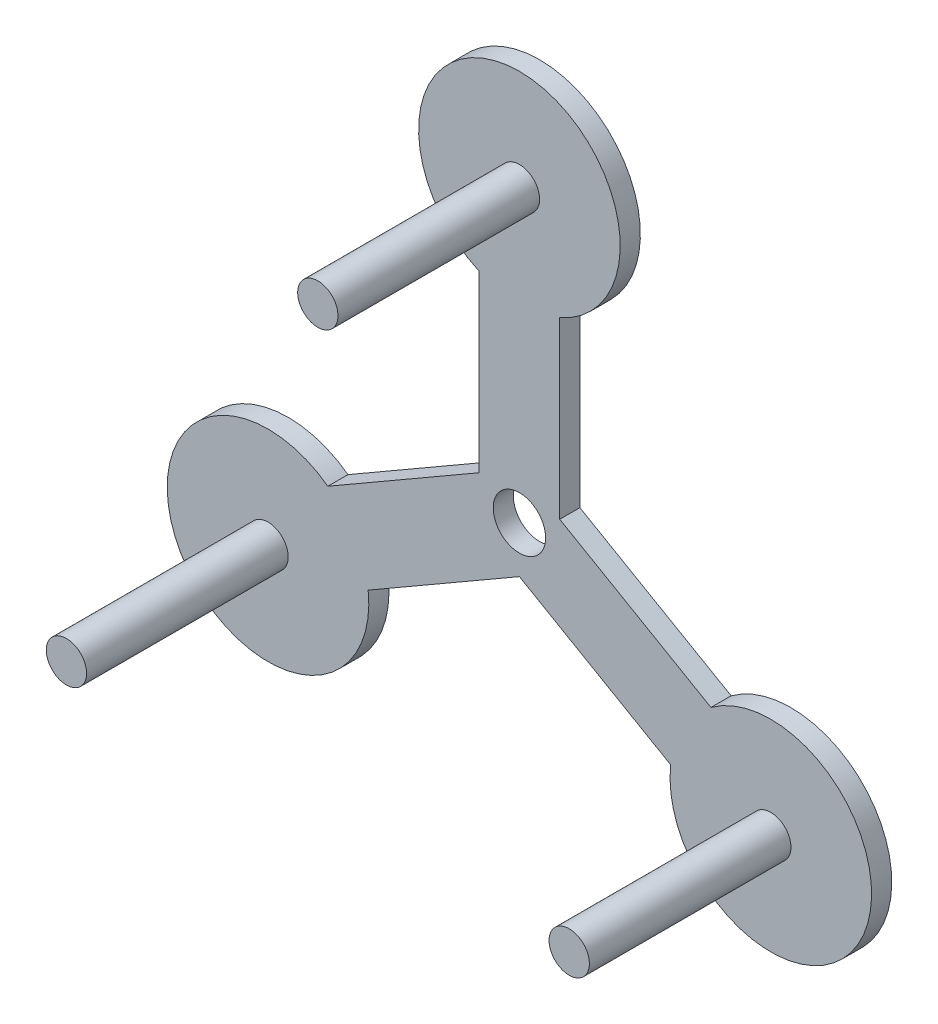
ISO-10303-21;
HEADER;
FILE_DESCRIPTION(('STEP AP214'),'2;1');
FILE_NAME('part.step','',(''),(''),'','','');
FILE_SCHEMA(('AUTOMOTIVE_DESIGN { 1 0 10303 214 1 1 1 1 }'));
ENDSEC;
DATA;
#1=APPLICATION_CONTEXT('core data for automotive mechanical design processes');
#2=APPLICATION_PROTOCOL_DEFINITION('international standard','automotive_design',2000,#1);
#3=PRODUCT_CONTEXT('',#1,'mechanical');
#4=PRODUCT('Part','Part','',(#3));
#5=PRODUCT_RELATED_PRODUCT_CATEGORY('part','',(#4));
#6=PRODUCT_DEFINITION_FORMATION('','',#4);
#7=PRODUCT_DEFINITION_CONTEXT('part definition',#1,'design');
#8=PRODUCT_DEFINITION('design','',#6,#7);
#9=PRODUCT_DEFINITION_SHAPE('','',#8);
#10=(LENGTH_UNIT() NAMED_UNIT(*) SI_UNIT(.MILLI.,.METRE.));
#11=(NAMED_UNIT(*) PLANE_ANGLE_UNIT() SI_UNIT($,.RADIAN.));
#12=(NAMED_UNIT(*) SI_UNIT($,.STERADIAN.) SOLID_ANGLE_UNIT());
#13=UNCERTAINTY_MEASURE_WITH_UNIT(LENGTH_MEASURE(1.E-05),#10,'distance_accuracy_value','');
#14=(GEOMETRIC_REPRESENTATION_CONTEXT(3) GLOBAL_UNCERTAINTY_ASSIGNED_CONTEXT((#13)) GLOBAL_UNIT_ASSIGNED_CONTEXT((#10,
#11,#12)) REPRESENTATION_CONTEXT('',''));
#15=CARTESIAN_POINT('',(0.,0.,0.));
#16=DIRECTION('',(0.,0.,1.));
#17=DIRECTION('',(1.,0.,0.));
#18=AXIS2_PLACEMENT_3D('',#15,#16,#17);
#19=CARTESIAN_POINT('',(9.99468367372348E-12,143.999999999995,100.));
#20=DIRECTION('',(0.,0.,-1.));
#21=DIRECTION('',(-1.,0.,0.));
#22=AXIS2_PLACEMENT_3D('',#19,#20,#21);
#23=CYLINDRICAL_SURFACE('',#22,9.999999999992);
#24=CARTESIAN_POINT('',(9.99468367372348E-12,143.999999999995,10.));
#25=DIRECTION('',(0.,0.,1.));
#26=DIRECTION('',(1.,0.,0.));
#27=AXIS2_PLACEMENT_3D('',#24,#25,#26);
#28=CIRCLE('',#27,9.999999999992);
#29=CARTESIAN_POINT('',(-9.999999999982,143.999999999995,10.));
#30=VERTEX_POINT('',#29);
#31=EDGE_CURVE('E182',#30,#30,#28,.T.);
#32=CARTESIAN_POINT('',(9.99468367372348E-12,143.999999999995,110.));
#33=DIRECTION('',(0.,0.,1.));
#34=DIRECTION('',(1.,0.,0.));
#35=AXIS2_PLACEMENT_3D('',#32,#33,#34);
#36=CIRCLE('',#35,9.99999999999199);
#37=CARTESIAN_POINT('',(-9.999999999982,143.999999999995,110.));
#38=VERTEX_POINT('',#37);
#39=EDGE_CURVE('E196',#38,#38,#36,.T.);
#40=CARTESIAN_POINT('',(-9.999999999982,143.999999999995,10.));
#41=CARTESIAN_POINT('',(-9.999999999982,143.999999999995,11.0416666666667));
#42=CARTESIAN_POINT('',(-9.999999999982,143.999999999995,12.0833333333333));
#43=CARTESIAN_POINT('',(-9.999999999982,143.999999999995,14.1666666666667));
#44=CARTESIAN_POINT('',(-9.999999999982,143.999999999995,15.2083333333333));
#45=CARTESIAN_POINT('',(-9.999999999982,143.999999999995,17.2916666666667));
#46=CARTESIAN_POINT('',(-9.999999999982,143.999999999995,18.3333333333333));
#47=CARTESIAN_POINT('',(-9.999999999982,143.999999999995,20.4166666666667));
#48=CARTESIAN_POINT('',(-9.999999999982,143.999999999995,21.4583333333333));
#49=CARTESIAN_POINT('',(-9.999999999982,143.999999999995,23.5416666666667));
#50=CARTESIAN_POINT('',(-9.999999999982,143.999999999995,24.5833333333333));
#51=CARTESIAN_POINT('',(-9.999999999982,143.999999999995,26.6666666666667));
#52=CARTESIAN_POINT('',(-9.999999999982,143.999999999995,27.7083333333333));
#53=CARTESIAN_POINT('',(-9.999999999982,143.999999999995,29.7916666666667));
#54=CARTESIAN_POINT('',(-9.999999999982,143.999999999995,30.8333333333333));
#55=CARTESIAN_POINT('',(-9.999999999982,143.999999999995,32.9166666666667));
#56=CARTESIAN_POINT('',(-9.999999999982,143.999999999995,33.9583333333333));
#57=CARTESIAN_POINT('',(-9.999999999982,143.999999999995,36.0416666666667));
#58=CARTESIAN_POINT('',(-9.999999999982,143.999999999995,37.0833333333333));
#59=CARTESIAN_POINT('',(-9.999999999982,143.999999999995,39.1666666666667));
#60=CARTESIAN_POINT('',(-9.999999999982,143.999999999995,40.2083333333333));
#61=CARTESIAN_POINT('',(-9.999999999982,143.999999999995,42.2916666666667));
#62=CARTESIAN_POINT('',(-9.999999999982,143.999999999995,43.3333333333333));
#63=CARTESIAN_POINT('',(-9.999999999982,143.999999999995,45.4166666666667));
#64=CARTESIAN_POINT('',(-9.999999999982,143.999999999995,46.4583333333333));
#65=CARTESIAN_POINT('',(-9.999999999982,143.999999999995,48.5416666666667));
#66=CARTESIAN_POINT('',(-9.999999999982,143.999999999995,49.5833333333333));
#67=CARTESIAN_POINT('',(-9.999999999982,143.999999999995,51.6666666666667));
#68=CARTESIAN_POINT('',(-9.999999999982,143.999999999995,52.7083333333333));
#69=CARTESIAN_POINT('',(-9.999999999982,143.999999999995,54.7916666666667));
#70=CARTESIAN_POINT('',(-9.999999999982,143.999999999995,55.8333333333333));
#71=CARTESIAN_POINT('',(-9.999999999982,143.999999999995,57.9166666666667));
#72=CARTESIAN_POINT('',(-9.999999999982,143.999999999995,58.9583333333333));
#73=CARTESIAN_POINT('',(-9.999999999982,143.999999999995,61.0416666666667));
#74=CARTESIAN_POINT('',(-9.999999999982,143.999999999995,62.0833333333333));
#75=CARTESIAN_POINT('',(-9.999999999982,143.999999999995,64.1666666666666));
#76=CARTESIAN_POINT('',(-9.999999999982,143.999999999995,65.2083333333333));
#77=CARTESIAN_POINT('',(-9.999999999982,143.999999999995,67.2916666666667));
#78=CARTESIAN_POINT('',(-9.999999999982,143.999999999995,68.3333333333333));
#79=CARTESIAN_POINT('',(-9.999999999982,143.999999999995,70.4166666666666));
#80=CARTESIAN_POINT('',(-9.999999999982,143.999999999995,71.4583333333333));
#81=CARTESIAN_POINT('',(-9.999999999982,143.999999999995,73.5416666666666));
#82=CARTESIAN_POINT('',(-9.999999999982,143.999999999995,74.5833333333333));
#83=CARTESIAN_POINT('',(-9.999999999982,143.999999999995,76.6666666666666));
#84=CARTESIAN_POINT('',(-9.999999999982,143.999999999995,77.7083333333333));
#85=CARTESIAN_POINT('',(-9.999999999982,143.999999999995,79.7916666666666));
#86=CARTESIAN_POINT('',(-9.999999999982,143.999999999995,80.8333333333333));
#87=CARTESIAN_POINT('',(-9.999999999982,143.999999999995,82.9166666666666));
#88=CARTESIAN_POINT('',(-9.999999999982,143.999999999995,83.9583333333333));
#89=CARTESIAN_POINT('',(-9.999999999982,143.999999999995,86.0416666666666));
#90=CARTESIAN_POINT('',(-9.999999999982,143.999999999995,87.0833333333333));
#91=CARTESIAN_POINT('',(-9.999999999982,143.999999999995,89.1666666666666));
#92=CARTESIAN_POINT('',(-9.999999999982,143.999999999995,90.2083333333333));
#93=CARTESIAN_POINT('',(-9.999999999982,143.999999999995,92.2916666666666));
#94=CARTESIAN_POINT('',(-9.999999999982,143.999999999995,93.3333333333333));
#95=CARTESIAN_POINT('',(-9.999999999982,143.999999999995,95.4166666666666));
#96=CARTESIAN_POINT('',(-9.999999999982,143.999999999995,96.4583333333333));
#97=CARTESIAN_POINT('',(-9.999999999982,143.999999999995,98.5416666666666));
#98=CARTESIAN_POINT('',(-9.999999999982,143.999999999995,99.5833333333333));
#99=CARTESIAN_POINT('',(-9.999999999982,143.999999999995,101.666666666667));
#100=CARTESIAN_POINT('',(-9.999999999982,143.999999999995,102.708333333333));
#101=CARTESIAN_POINT('',(-9.999999999982,143.999999999995,104.791666666667));
#102=CARTESIAN_POINT('',(-9.999999999982,143.999999999995,105.833333333333));
#103=CARTESIAN_POINT('',(-9.999999999982,143.999999999995,107.916666666667));
#104=CARTESIAN_POINT('',(-9.999999999982,143.999999999995,108.958333333333));
#105=CARTESIAN_POINT('',(-9.999999999982,143.999999999995,110.));
#106=B_SPLINE_CURVE_WITH_KNOTS('',3,(#40,#41,#42,#43,#44,#45,#46,#47,#48,#49,#50,#51,#52,#53,
#54,#55,#56,#57,#58,#59,#60,#61,#62,#63,#64,#65,#66,#67,#68,#69,#70,#71,#72,#73,#74,#75,#76,#77,
#78,#79,#80,#81,#82,#83,#84,#85,#86,#87,#88,#89,#90,#91,#92,#93,#94,#95,#96,#97,#98,#99,#100,
#101,#102,#103,#104,#105),.UNSPECIFIED.,.F.,.F.,(4,2,2,2,2,2,2,2,2,2,2,2,2,2,2,2,2,2,2,2,2,2,2,
2,2,2,2,2,2,2,2,2,4),(0.,3.125,6.25000000000001,9.37499999999999,12.5,15.625,18.75,21.875,25.,
28.125,31.25,34.375,37.5,40.625,43.75,46.875,50.,53.125,56.25,59.375,62.5,65.625,68.75,71.875,
75.,78.125,81.25,84.375,87.5,90.625,93.75,96.875,100.),.UNSPECIFIED.);
#107=EDGE_CURVE('BSEAM32',#30,#38,#106,.T.);
#108=ORIENTED_EDGE('',*,*,#31,.T.);
#109=ORIENTED_EDGE('',*,*,#39,.F.);
#110=ORIENTED_EDGE('',*,*,#107,.T.);
#111=ORIENTED_EDGE('',*,*,#107,.F.);
#112=EDGE_LOOP('',(#108,#110,#109,#111));
#113=FACE_BOUND('',#112,.T.);
#114=ADVANCED_FACE('F32',(#113),#23,.T.);
#115=CARTESIAN_POINT('',(-20.,11.5470053837933,10.));
#116=DIRECTION('',(1.,0.,0.));
#117=DIRECTION('',(0.,0.,-1.));
#118=AXIS2_PLACEMENT_3D('',#115,#116,#117);
#119=PLANE('',#118);
#120=DIRECTION('',(0.,-1.,0.));
#121=VECTOR('',#120,1.);
#122=CARTESIAN_POINT('',(-20.,11.5470053837933,10.));
#123=LINE('',#122,#121);
#124=CARTESIAN_POINT('',(-20.,98.1742430504419,10.));
#125=VERTEX_POINT('',#124);
#126=CARTESIAN_POINT('',(-20.,11.5470053837933,10.));
#127=VERTEX_POINT('',#126);
#128=EDGE_CURVE('E127',#125,#127,#123,.T.);
#129=ORIENTED_EDGE('',*,*,#128,.F.);
#130=DIRECTION('',(0.,0.,1.));
#131=VECTOR('',#130,1.);
#132=CARTESIAN_POINT('',(-20.,98.1742430504419,0.));
#133=LINE('',#132,#131);
#134=CARTESIAN_POINT('',(-20.,98.1742430504419,0.));
#135=VERTEX_POINT('',#134);
#136=EDGE_CURVE('E169',#125,#135,#133,.F.);
#137=ORIENTED_EDGE('',*,*,#136,.T.);
#138=DIRECTION('',(0.,-1.,0.));
#139=VECTOR('',#138,1.);
#140=CARTESIAN_POINT('',(-20.,11.5470053837933,0.));
#141=LINE('',#140,#139);
#142=CARTESIAN_POINT('',(-20.,11.5470053837933,0.));
#143=VERTEX_POINT('',#142);
#144=EDGE_CURVE('E150',#135,#143,#141,.T.);
#145=ORIENTED_EDGE('',*,*,#144,.T.);
#146=DIRECTION('',(0.,0.,-1.));
#147=VECTOR('',#146,1.);
#148=CARTESIAN_POINT('',(-20.,11.5470053837933,10.));
#149=LINE('',#148,#147);
#150=EDGE_CURVE('E11',#127,#143,#149,.T.);
#151=ORIENTED_EDGE('',*,*,#150,.F.);
#152=EDGE_LOOP('',(#129,#137,#145,#151));
#153=FACE_BOUND('',#152,.T.);
#154=ADVANCED_FACE('F34',(#153),#119,.F.);
#155=CARTESIAN_POINT('',(-134.707658144959,-54.6794919243113,10.));
#156=DIRECTION('',(0.500000000000004,-0.866025403784436,0.));
#157=DIRECTION('',(0.866025403784436,0.500000000000004,0.));
#158=AXIS2_PLACEMENT_3D('',#155,#156,#157);
#159=PLANE('',#158);
#160=DIRECTION('',(-0.866025403784436,-0.500000000000004,0.));
#161=VECTOR('',#160,1.);
#162=CARTESIAN_POINT('',(-134.707658144959,-54.6794919243113,0.));
#163=LINE('',#162,#161);
#164=CARTESIAN_POINT('',(-95.0213884789905,-31.7666134495318,0.));
#165=VERTEX_POINT('',#164);
#166=EDGE_CURVE('E149',#143,#165,#163,.T.);
#167=ORIENTED_EDGE('',*,*,#166,.T.);
#168=DIRECTION('',(0.,0.,1.));
#169=VECTOR('',#168,1.);
#170=CARTESIAN_POINT('',(-95.0213884789905,-31.7666134495319,0.));
#171=LINE('',#170,#169);
#172=CARTESIAN_POINT('',(-95.0213884789905,-31.7666134495318,10.));
#173=VERTEX_POINT('',#172);
#174=EDGE_CURVE('E154',#165,#173,#171,.T.);
#175=ORIENTED_EDGE('',*,*,#174,.T.);
#176=DIRECTION('',(-0.866025403784436,-0.500000000000004,0.));
#177=VECTOR('',#176,1.);
#178=CARTESIAN_POINT('',(-134.707658144959,-54.6794919243113,10.));
#179=LINE('',#178,#177);
#180=EDGE_CURVE('E161',#127,#173,#179,.T.);
#181=ORIENTED_EDGE('',*,*,#180,.F.);
#182=ORIENTED_EDGE('',*,*,#150,.T.);
#183=EDGE_LOOP('',(#167,#175,#181,#182));
#184=FACE_BOUND('',#183,.T.);
#185=ADVANCED_FACE('F230',(#184),#159,.F.);
#186=CARTESIAN_POINT('',(0.,-23.0940107675842,10.));
#187=DIRECTION('',(-0.500000000000005,0.866025403784436,0.));
#188=DIRECTION('',(-0.866025403784436,-0.500000000000005,0.));
#189=AXIS2_PLACEMENT_3D('',#186,#187,#188);
#190=PLANE('',#189);
#191=DIRECTION('',(0.866025403784436,0.500000000000004,0.));
#192=VECTOR('',#191,1.);
#193=CARTESIAN_POINT('',(0.,-23.0940107675842,10.));
#194=LINE('',#193,#192);
#195=CARTESIAN_POINT('',(-75.0213884789903,-66.4076296009093,10.));
#196=VERTEX_POINT('',#195);
#197=CARTESIAN_POINT('',(0.,-23.0940107675842,10.));
#198=VERTEX_POINT('',#197);
#199=EDGE_CURVE('E159',#196,#198,#194,.T.);
#200=ORIENTED_EDGE('',*,*,#199,.F.);
#201=DIRECTION('',(0.,0.,1.));
#202=VECTOR('',#201,1.);
#203=CARTESIAN_POINT('',(-75.0213884789903,-66.4076296009093,0.));
#204=LINE('',#203,#202);
#205=CARTESIAN_POINT('',(-75.0213884789903,-66.4076296009093,0.));
#206=VERTEX_POINT('',#205);
#207=EDGE_CURVE('E166',#196,#206,#204,.F.);
#208=ORIENTED_EDGE('',*,*,#207,.T.);
#209=DIRECTION('',(0.866025403784436,0.500000000000004,0.));
#210=VECTOR('',#209,1.);
#211=CARTESIAN_POINT('',(0.,-23.0940107675842,0.));
#212=LINE('',#211,#210);
#213=CARTESIAN_POINT('',(0.,-23.0940107675842,0.));
#214=VERTEX_POINT('',#213);
#215=EDGE_CURVE('E129',#206,#214,#212,.T.);
#216=ORIENTED_EDGE('',*,*,#215,.T.);
#217=DIRECTION('',(0.,0.,-1.));
#218=VECTOR('',#217,1.);
#219=CARTESIAN_POINT('',(0.,-23.0940107675842,10.));
#220=LINE('',#219,#218);
#221=EDGE_CURVE('E40',#198,#214,#220,.T.);
#222=ORIENTED_EDGE('',*,*,#221,.F.);
#223=EDGE_LOOP('',(#200,#208,#216,#222));
#224=FACE_BOUND('',#223,.T.);
#225=ADVANCED_FACE('F256',(#224),#190,.F.);
#226=CARTESIAN_POINT('',(114.707658144959,-89.3205080756888,10.));
#227=DIRECTION('',(0.500000000000004,0.866025403784436,0.));
#228=DIRECTION('',(-0.866025403784436,0.500000000000004,0.));
#229=AXIS2_PLACEMENT_3D('',#226,#227,#228);
#230=PLANE('',#229);
#231=DIRECTION('',(0.866025403784436,-0.500000000000004,0.));
#232=VECTOR('',#231,1.);
#233=CARTESIAN_POINT('',(114.707658144959,-89.3205080756888,0.));
#234=LINE('',#233,#232);
#235=CARTESIAN_POINT('',(75.0213884789898,-66.407629600909,0.));
#236=VERTEX_POINT('',#235);
#237=EDGE_CURVE('E125',#214,#236,#234,.T.);
#238=ORIENTED_EDGE('',*,*,#237,.T.);
#239=DIRECTION('',(0.,0.,1.));
#240=VECTOR('',#239,1.);
#241=CARTESIAN_POINT('',(75.0213884789898,-66.407629600909,0.));
#242=LINE('',#241,#240);
#243=CARTESIAN_POINT('',(75.0213884789898,-66.407629600909,10.));
#244=VERTEX_POINT('',#243);
#245=EDGE_CURVE('E107',#236,#244,#242,.T.);
#246=ORIENTED_EDGE('',*,*,#245,.T.);
#247=DIRECTION('',(0.866025403784436,-0.500000000000004,0.));
#248=VECTOR('',#247,1.);
#249=CARTESIAN_POINT('',(114.707658144959,-89.3205080756888,10.));
#250=LINE('',#249,#248);
#251=EDGE_CURVE('E140',#198,#244,#250,.T.);
#252=ORIENTED_EDGE('',*,*,#251,.F.);
#253=ORIENTED_EDGE('',*,*,#221,.T.);
#254=EDGE_LOOP('',(#238,#246,#252,#253));
#255=FACE_BOUND('',#254,.T.);
#256=ADVANCED_FACE('F139',(#255),#230,.F.);
#257=CARTESIAN_POINT('',(20.,11.5470053837933,10.));
#258=DIRECTION('',(-0.500000000000004,-0.866025403784436,0.));
#259=DIRECTION('',(0.866025403784436,-0.500000000000004,0.));
#260=AXIS2_PLACEMENT_3D('',#257,#258,#259);
#261=PLANE('',#260);
#262=DIRECTION('',(-0.866025403784436,0.500000000000004,0.));
#263=VECTOR('',#262,1.);
#264=CARTESIAN_POINT('',(20.,11.5470053837933,10.));
#265=LINE('',#264,#263);
#266=CARTESIAN_POINT('',(95.021388478991,-31.7666134495322,10.));
#267=VERTEX_POINT('',#266);
#268=CARTESIAN_POINT('',(20.,11.5470053837933,10.));
#269=VERTEX_POINT('',#268);
#270=EDGE_CURVE('E118',#267,#269,#265,.T.);
#271=ORIENTED_EDGE('',*,*,#270,.F.);
#272=DIRECTION('',(0.,0.,1.));
#273=VECTOR('',#272,1.);
#274=CARTESIAN_POINT('',(95.021388478991,-31.7666134495322,0.));
#275=LINE('',#274,#273);
#276=CARTESIAN_POINT('',(95.021388478991,-31.7666134495322,0.));
#277=VERTEX_POINT('',#276);
#278=EDGE_CURVE('E104',#267,#277,#275,.F.);
#279=ORIENTED_EDGE('',*,*,#278,.T.);
#280=DIRECTION('',(-0.866025403784436,0.500000000000004,0.));
#281=VECTOR('',#280,1.);
#282=CARTESIAN_POINT('',(20.,11.5470053837933,0.));
#283=LINE('',#282,#281);
#284=CARTESIAN_POINT('',(20.,11.5470053837933,0.));
#285=VERTEX_POINT('',#284);
#286=EDGE_CURVE('E116',#277,#285,#283,.T.);
#287=ORIENTED_EDGE('',*,*,#286,.T.);
#288=DIRECTION('',(0.,0.,-1.));
#289=VECTOR('',#288,1.);
#290=CARTESIAN_POINT('',(20.,11.5470053837933,10.));
#291=LINE('',#290,#289);
#292=EDGE_CURVE('E133',#269,#285,#291,.T.);
#293=ORIENTED_EDGE('',*,*,#292,.F.);
#294=EDGE_LOOP('',(#271,#279,#287,#293));
#295=FACE_BOUND('',#294,.T.);
#296=ADVANCED_FACE('F114',(#295),#261,.F.);
#297=CARTESIAN_POINT('',(20.,144.,10.));
#298=DIRECTION('',(-1.,0.,0.));
#299=DIRECTION('',(0.,0.,1.));
#300=AXIS2_PLACEMENT_3D('',#297,#298,#299);
#301=PLANE('',#300);
#302=DIRECTION('',(0.,1.,0.));
#303=VECTOR('',#302,1.);
#304=CARTESIAN_POINT('',(20.,144.,0.));
#305=LINE('',#304,#303);
#306=CARTESIAN_POINT('',(20.,98.1742430504413,0.));
#307=VERTEX_POINT('',#306);
#308=EDGE_CURVE('E124',#285,#307,#305,.T.);
#309=ORIENTED_EDGE('',*,*,#308,.T.);
#310=DIRECTION('',(0.,0.,1.));
#311=VECTOR('',#310,1.);
#312=CARTESIAN_POINT('',(20.,98.1742430504413,0.));
#313=LINE('',#312,#311);
#314=CARTESIAN_POINT('',(20.,98.1742430504413,10.));
#315=VERTEX_POINT('',#314);
#316=EDGE_CURVE('E173',#307,#315,#313,.T.);
#317=ORIENTED_EDGE('',*,*,#316,.T.);
#318=DIRECTION('',(0.,1.,0.));
#319=VECTOR('',#318,1.);
#320=CARTESIAN_POINT('',(20.,144.,10.));
#321=LINE('',#320,#319);
#322=EDGE_CURVE('E134',#269,#315,#321,.T.);
#323=ORIENTED_EDGE('',*,*,#322,.F.);
#324=ORIENTED_EDGE('',*,*,#292,.T.);
#325=EDGE_LOOP('',(#309,#317,#323,#324));
#326=FACE_BOUND('',#325,.T.);
#327=ADVANCED_FACE('F244',(#326),#301,.F.);
#328=CARTESIAN_POINT('',(0.,0.,10.));
#329=DIRECTION('',(0.,0.,1.));
#330=DIRECTION('',(1.,0.,0.));
#331=AXIS2_PLACEMENT_3D('',#328,#329,#330);
#332=PLANE('',#331);
#333=CARTESIAN_POINT('',(0.,0.,10.));
#334=DIRECTION('',(0.,0.,1.));
#335=DIRECTION('',(1.,0.,0.));
#336=AXIS2_PLACEMENT_3D('',#333,#334,#335);
#337=CIRCLE('',#336,13.);
#338=CARTESIAN_POINT('',(13.,0.,10.));
#339=VERTEX_POINT('',#338);
#340=EDGE_CURVE('E193',#339,#339,#337,.T.);
#341=ORIENTED_EDGE('',*,*,#340,.F.);
#342=EDGE_LOOP('',(#341));
#343=FACE_BOUND('',#342,.T.);
#344=CARTESIAN_POINT('',(-124.70765814495,-71.9999999999941,10.));
#345=DIRECTION('',(0.,0.,1.));
#346=DIRECTION('',(1.,0.,0.));
#347=AXIS2_PLACEMENT_3D('',#344,#345,#346);
#348=CIRCLE('',#347,10.0000000000037);
#349=CARTESIAN_POINT('',(-134.707658144954,-71.9999999999941,10.));
#350=VERTEX_POINT('',#349);
#351=EDGE_CURVE('E189',#350,#350,#348,.T.);
#352=ORIENTED_EDGE('',*,*,#351,.F.);
#353=EDGE_LOOP('',(#352));
#354=FACE_BOUND('',#353,.T.);
#355=CARTESIAN_POINT('',(124.707658144959,-72.0000000000006,10.));
#356=DIRECTION('',(0.,0.,1.));
#357=DIRECTION('',(1.,0.,0.));
#358=AXIS2_PLACEMENT_3D('',#355,#356,#357);
#359=CIRCLE('',#358,9.99999999999999);
#360=CARTESIAN_POINT('',(114.707658144959,-72.0000000000006,10.));
#361=VERTEX_POINT('',#360);
#362=EDGE_CURVE('E186',#361,#361,#359,.T.);
#363=ORIENTED_EDGE('',*,*,#362,.F.);
#364=EDGE_LOOP('',(#363));
#365=FACE_BOUND('',#364,.T.);
#366=ORIENTED_EDGE('',*,*,#31,.F.);
#367=EDGE_LOOP('',(#366));
#368=FACE_BOUND('',#367,.T.);
#369=ORIENTED_EDGE('',*,*,#251,.T.);
#370=CARTESIAN_POINT('',(124.707658144958,-72.0000000000012,10.));
#371=DIRECTION('',(0.,0.,1.));
#372=DIRECTION('',(1.,0.,0.));
#373=AXIS2_PLACEMENT_3D('',#370,#371,#372);
#374=CIRCLE('',#373,50.);
#375=EDGE_CURVE('E47',#244,#267,#374,.T.);
#376=ORIENTED_EDGE('',*,*,#375,.T.);
#377=ORIENTED_EDGE('',*,*,#270,.T.);
#378=ORIENTED_EDGE('',*,*,#322,.T.);
#379=CARTESIAN_POINT('',(7.07767178198537E-13,144.,10.));
#380=DIRECTION('',(0.,0.,1.));
#381=DIRECTION('',(1.,0.,0.));
#382=AXIS2_PLACEMENT_3D('',#379,#380,#381);
#383=CIRCLE('',#382,50.);
#384=EDGE_CURVE('E177',#315,#125,#383,.T.);
#385=ORIENTED_EDGE('',*,*,#384,.T.);
#386=ORIENTED_EDGE('',*,*,#128,.T.);
#387=ORIENTED_EDGE('',*,*,#180,.T.);
#388=CARTESIAN_POINT('',(-124.707658144959,-72.,10.));
#389=DIRECTION('',(0.,0.,1.));
#390=DIRECTION('',(1.,0.,0.));
#391=AXIS2_PLACEMENT_3D('',#388,#389,#390);
#392=CIRCLE('',#391,50.);
#393=EDGE_CURVE('E54',#173,#196,#392,.T.);
#394=ORIENTED_EDGE('',*,*,#393,.T.);
#395=ORIENTED_EDGE('',*,*,#199,.T.);
#396=EDGE_LOOP('',(#369,#376,#377,#378,#385,#386,#387,#394,#395));
#397=FACE_BOUND('',#396,.T.);
#398=ADVANCED_FACE('F241',(#343,#354,#365,#368,#397),#332,.T.);
#399=CARTESIAN_POINT('',(0.,0.,0.));
#400=DIRECTION('',(0.,0.,1.));
#401=DIRECTION('',(1.,0.,0.));
#402=AXIS2_PLACEMENT_3D('',#399,#400,#401);
#403=PLANE('',#402);
#404=CARTESIAN_POINT('',(0.,0.,0.));
#405=DIRECTION('',(0.,0.,1.));
#406=DIRECTION('',(1.,0.,0.));
#407=AXIS2_PLACEMENT_3D('',#404,#405,#406);
#408=CIRCLE('',#407,13.);
#409=CARTESIAN_POINT('',(13.,0.,0.));
#410=VERTEX_POINT('',#409);
#411=EDGE_CURVE('E192',#410,#410,#408,.T.);
#412=ORIENTED_EDGE('',*,*,#411,.T.);
#413=EDGE_LOOP('',(#412));
#414=FACE_BOUND('',#413,.T.);
#415=ORIENTED_EDGE('',*,*,#286,.F.);
#416=CARTESIAN_POINT('',(124.707658144958,-72.0000000000012,0.));
#417=DIRECTION('',(0.,0.,1.));
#418=DIRECTION('',(1.,0.,0.));
#419=AXIS2_PLACEMENT_3D('',#416,#417,#418);
#420=CIRCLE('',#419,50.);
#421=EDGE_CURVE('E101',#236,#277,#420,.T.);
#422=ORIENTED_EDGE('',*,*,#421,.F.);
#423=ORIENTED_EDGE('',*,*,#237,.F.);
#424=ORIENTED_EDGE('',*,*,#215,.F.);
#425=CARTESIAN_POINT('',(-124.707658144959,-72.,0.));
#426=DIRECTION('',(0.,0.,1.));
#427=DIRECTION('',(1.,0.,0.));
#428=AXIS2_PLACEMENT_3D('',#425,#426,#427);
#429=CIRCLE('',#428,50.);
#430=EDGE_CURVE('E146',#165,#206,#429,.T.);
#431=ORIENTED_EDGE('',*,*,#430,.F.);
#432=ORIENTED_EDGE('',*,*,#166,.F.);
#433=ORIENTED_EDGE('',*,*,#144,.F.);
#434=CARTESIAN_POINT('',(7.07767178198537E-13,144.,0.));
#435=DIRECTION('',(0.,0.,1.));
#436=DIRECTION('',(1.,0.,0.));
#437=AXIS2_PLACEMENT_3D('',#434,#435,#436);
#438=CIRCLE('',#437,50.);
#439=EDGE_CURVE('E176',#307,#135,#438,.T.);
#440=ORIENTED_EDGE('',*,*,#439,.F.);
#441=ORIENTED_EDGE('',*,*,#308,.F.);
#442=EDGE_LOOP('',(#415,#422,#423,#424,#431,#432,#433,#440,#441));
#443=FACE_BOUND('',#442,.T.);
#444=ADVANCED_FACE('F121',(#414,#443),#403,.F.);
#445=CARTESIAN_POINT('',(-124.707658144959,-72.,0.));
#446=DIRECTION('',(0.,0.,1.));
#447=DIRECTION('',(1.,0.,0.));
#448=AXIS2_PLACEMENT_3D('',#445,#446,#447);
#449=CYLINDRICAL_SURFACE('',#448,50.);
#450=ORIENTED_EDGE('',*,*,#174,.F.);
#451=ORIENTED_EDGE('',*,*,#430,.T.);
#452=ORIENTED_EDGE('',*,*,#207,.F.);
#453=ORIENTED_EDGE('',*,*,#393,.F.);
#454=EDGE_LOOP('',(#450,#451,#452,#453));
#455=FACE_BOUND('',#454,.T.);
#456=ADVANCED_FACE('F236',(#455),#449,.T.);
#457=CARTESIAN_POINT('',(7.07767178198537E-13,144.,0.));
#458=DIRECTION('',(0.,0.,1.));
#459=DIRECTION('',(1.,0.,0.));
#460=AXIS2_PLACEMENT_3D('',#457,#458,#459);
#461=CYLINDRICAL_SURFACE('',#460,50.);
#462=ORIENTED_EDGE('',*,*,#136,.F.);
#463=ORIENTED_EDGE('',*,*,#384,.F.);
#464=ORIENTED_EDGE('',*,*,#316,.F.);
#465=ORIENTED_EDGE('',*,*,#439,.T.);
#466=EDGE_LOOP('',(#462,#463,#464,#465));
#467=FACE_BOUND('',#466,.T.);
#468=ADVANCED_FACE('F222',(#467),#461,.T.);
#469=CARTESIAN_POINT('',(124.707658144958,-72.0000000000012,0.));
#470=DIRECTION('',(0.,0.,1.));
#471=DIRECTION('',(1.,0.,0.));
#472=AXIS2_PLACEMENT_3D('',#469,#470,#471);
#473=CYLINDRICAL_SURFACE('',#472,50.);
#474=ORIENTED_EDGE('',*,*,#245,.F.);
#475=ORIENTED_EDGE('',*,*,#421,.T.);
#476=ORIENTED_EDGE('',*,*,#278,.F.);
#477=ORIENTED_EDGE('',*,*,#375,.F.);
#478=EDGE_LOOP('',(#474,#475,#476,#477));
#479=FACE_BOUND('',#478,.T.);
#480=ADVANCED_FACE('F103',(#479),#473,.T.);
#481=CARTESIAN_POINT('',(124.707658144959,-72.0000000000006,100.));
#482=DIRECTION('',(0.,0.,-1.));
#483=DIRECTION('',(-1.,0.,0.));
#484=AXIS2_PLACEMENT_3D('',#481,#482,#483);
#485=CYLINDRICAL_SURFACE('',#484,9.99999999999999);
#486=CARTESIAN_POINT('',(124.707658144959,-72.0000000000006,110.));
#487=DIRECTION('',(0.,0.,1.));
#488=DIRECTION('',(1.,0.,0.));
#489=AXIS2_PLACEMENT_3D('',#486,#487,#488);
#490=CIRCLE('',#489,9.99999999999999);
#491=CARTESIAN_POINT('',(114.707658144959,-72.0000000000006,110.));
#492=VERTEX_POINT('',#491);
#493=EDGE_CURVE('E204',#492,#492,#490,.T.);
#494=CARTESIAN_POINT('',(114.707658144959,-72.0000000000006,10.));
#495=CARTESIAN_POINT('',(114.707658144959,-72.0000000000006,11.0416666666667));
#496=CARTESIAN_POINT('',(114.707658144959,-72.0000000000006,12.0833333333333));
#497=CARTESIAN_POINT('',(114.707658144959,-72.0000000000006,14.1666666666667));
#498=CARTESIAN_POINT('',(114.707658144959,-72.0000000000006,15.2083333333333));
#499=CARTESIAN_POINT('',(114.707658144959,-72.0000000000006,17.2916666666667));
#500=CARTESIAN_POINT('',(114.707658144959,-72.0000000000006,18.3333333333333));
#501=CARTESIAN_POINT('',(114.707658144959,-72.0000000000006,20.4166666666667));
#502=CARTESIAN_POINT('',(114.707658144959,-72.0000000000006,21.4583333333333));
#503=CARTESIAN_POINT('',(114.707658144959,-72.0000000000006,23.5416666666667));
#504=CARTESIAN_POINT('',(114.707658144959,-72.0000000000006,24.5833333333333));
#505=CARTESIAN_POINT('',(114.707658144959,-72.0000000000006,26.6666666666667));
#506=CARTESIAN_POINT('',(114.707658144959,-72.0000000000006,27.7083333333333));
#507=CARTESIAN_POINT('',(114.707658144959,-72.0000000000006,29.7916666666667));
#508=CARTESIAN_POINT('',(114.707658144959,-72.0000000000006,30.8333333333333));
#509=CARTESIAN_POINT('',(114.707658144959,-72.0000000000006,32.9166666666667));
#510=CARTESIAN_POINT('',(114.707658144959,-72.0000000000006,33.9583333333333));
#511=CARTESIAN_POINT('',(114.707658144959,-72.0000000000006,36.0416666666667));
#512=CARTESIAN_POINT('',(114.707658144959,-72.0000000000006,37.0833333333333));
#513=CARTESIAN_POINT('',(114.707658144959,-72.0000000000006,39.1666666666667));
#514=CARTESIAN_POINT('',(114.707658144959,-72.0000000000006,40.2083333333333));
#515=CARTESIAN_POINT('',(114.707658144959,-72.0000000000006,42.2916666666667));
#516=CARTESIAN_POINT('',(114.707658144959,-72.0000000000006,43.3333333333333));
#517=CARTESIAN_POINT('',(114.707658144959,-72.0000000000006,45.4166666666667));
#518=CARTESIAN_POINT('',(114.707658144959,-72.0000000000006,46.4583333333333));
#519=CARTESIAN_POINT('',(114.707658144959,-72.0000000000006,48.5416666666667));
#520=CARTESIAN_POINT('',(114.707658144959,-72.0000000000006,49.5833333333333));
#521=CARTESIAN_POINT('',(114.707658144959,-72.0000000000006,51.6666666666667));
#522=CARTESIAN_POINT('',(114.707658144959,-72.0000000000006,52.7083333333333));
#523=CARTESIAN_POINT('',(114.707658144959,-72.0000000000006,54.7916666666667));
#524=CARTESIAN_POINT('',(114.707658144959,-72.0000000000006,55.8333333333333));
#525=CARTESIAN_POINT('',(114.707658144959,-72.0000000000006,57.9166666666667));
#526=CARTESIAN_POINT('',(114.707658144959,-72.0000000000006,58.9583333333333));
#527=CARTESIAN_POINT('',(114.707658144959,-72.0000000000006,61.0416666666667));
#528=CARTESIAN_POINT('',(114.707658144959,-72.0000000000006,62.0833333333333));
#529=CARTESIAN_POINT('',(114.707658144959,-72.0000000000006,64.1666666666666));
#530=CARTESIAN_POINT('',(114.707658144959,-72.0000000000006,65.2083333333333));
#531=CARTESIAN_POINT('',(114.707658144959,-72.0000000000006,67.2916666666667));
#532=CARTESIAN_POINT('',(114.707658144959,-72.0000000000006,68.3333333333333));
#533=CARTESIAN_POINT('',(114.707658144959,-72.0000000000006,70.4166666666666));
#534=CARTESIAN_POINT('',(114.707658144959,-72.0000000000006,71.4583333333333));
#535=CARTESIAN_POINT('',(114.707658144959,-72.0000000000006,73.5416666666666));
#536=CARTESIAN_POINT('',(114.707658144959,-72.0000000000006,74.5833333333333));
#537=CARTESIAN_POINT('',(114.707658144959,-72.0000000000006,76.6666666666666));
#538=CARTESIAN_POINT('',(114.707658144959,-72.0000000000006,77.7083333333333));
#539=CARTESIAN_POINT('',(114.707658144959,-72.0000000000006,79.7916666666666));
#540=CARTESIAN_POINT('',(114.707658144959,-72.0000000000006,80.8333333333333));
#541=CARTESIAN_POINT('',(114.707658144959,-72.0000000000006,82.9166666666666));
#542=CARTESIAN_POINT('',(114.707658144959,-72.0000000000006,83.9583333333333));
#543=CARTESIAN_POINT('',(114.707658144959,-72.0000000000006,86.0416666666666));
#544=CARTESIAN_POINT('',(114.707658144959,-72.0000000000006,87.0833333333333));
#545=CARTESIAN_POINT('',(114.707658144959,-72.0000000000006,89.1666666666666));
#546=CARTESIAN_POINT('',(114.707658144959,-72.0000000000006,90.2083333333333));
#547=CARTESIAN_POINT('',(114.707658144959,-72.0000000000006,92.2916666666666));
#548=CARTESIAN_POINT('',(114.707658144959,-72.0000000000006,93.3333333333333));
#549=CARTESIAN_POINT('',(114.707658144959,-72.0000000000006,95.4166666666666));
#550=CARTESIAN_POINT('',(114.707658144959,-72.0000000000006,96.4583333333333));
#551=CARTESIAN_POINT('',(114.707658144959,-72.0000000000006,98.5416666666666));
#552=CARTESIAN_POINT('',(114.707658144959,-72.0000000000006,99.5833333333333));
#553=CARTESIAN_POINT('',(114.707658144959,-72.0000000000006,101.666666666667));
#554=CARTESIAN_POINT('',(114.707658144959,-72.0000000000006,102.708333333333));
#555=CARTESIAN_POINT('',(114.707658144959,-72.0000000000006,104.791666666667));
#556=CARTESIAN_POINT('',(114.707658144959,-72.0000000000006,105.833333333333));
#557=CARTESIAN_POINT('',(114.707658144959,-72.0000000000006,107.916666666667));
#558=CARTESIAN_POINT('',(114.707658144959,-72.0000000000006,108.958333333333));
#559=CARTESIAN_POINT('',(114.707658144959,-72.0000000000006,110.));
#560=B_SPLINE_CURVE_WITH_KNOTS('',3,(#494,#495,#496,#497,#498,#499,#500,#501,#502,#503,#504,
#505,#506,#507,#508,#509,#510,#511,#512,#513,#514,#515,#516,#517,#518,#519,#520,#521,#522,#523,
#524,#525,#526,#527,#528,#529,#530,#531,#532,#533,#534,#535,#536,#537,#538,#539,#540,#541,#542,
#543,#544,#545,#546,#547,#548,#549,#550,#551,#552,#553,#554,#555,#556,#557,#558,#559),
.UNSPECIFIED.,.F.,.F.,(4,2,2,2,2,2,2,2,2,2,2,2,2,2,2,2,2,2,2,2,2,2,2,2,2,2,2,2,2,2,2,2,4),(0.,
3.125,6.25000000000001,9.37499999999999,12.5,15.625,18.75,21.875,25.,28.125,31.25,34.375,37.5,
40.625,43.75,46.875,50.,53.125,56.25,59.375,62.5,65.625,68.75,71.875,75.,78.125,81.25,84.375,
87.5,90.625,93.75,96.875,100.),.UNSPECIFIED.);
#561=EDGE_CURVE('BSEAM210',#361,#492,#560,.T.);
#562=ORIENTED_EDGE('',*,*,#362,.T.);
#563=ORIENTED_EDGE('',*,*,#493,.F.);
#564=ORIENTED_EDGE('',*,*,#561,.T.);
#565=ORIENTED_EDGE('',*,*,#561,.F.);
#566=EDGE_LOOP('',(#562,#564,#563,#565));
#567=FACE_BOUND('',#566,.T.);
#568=ADVANCED_FACE('F210',(#567),#485,.T.);
#569=CARTESIAN_POINT('',(-124.70765814495,-71.9999999999941,100.));
#570=DIRECTION('',(0.,0.,-1.));
#571=DIRECTION('',(-1.,0.,0.));
#572=AXIS2_PLACEMENT_3D('',#569,#570,#571);
#573=CYLINDRICAL_SURFACE('',#572,10.0000000000037);
#574=CARTESIAN_POINT('',(-124.70765814495,-71.9999999999941,110.));
#575=DIRECTION('',(0.,0.,1.));
#576=DIRECTION('',(1.,0.,0.));
#577=AXIS2_PLACEMENT_3D('',#574,#575,#576);
#578=CIRCLE('',#577,10.0000000000037);
#579=CARTESIAN_POINT('',(-134.707658144954,-71.9999999999941,110.));
#580=VERTEX_POINT('',#579);
#581=EDGE_CURVE('E201',#580,#580,#578,.T.);
#582=CARTESIAN_POINT('',(-134.707658144954,-71.9999999999941,10.));
#583=CARTESIAN_POINT('',(-134.707658144954,-71.9999999999941,11.0416666666667));
#584=CARTESIAN_POINT('',(-134.707658144954,-71.9999999999941,12.0833333333333));
#585=CARTESIAN_POINT('',(-134.707658144954,-71.9999999999941,14.1666666666667));
#586=CARTESIAN_POINT('',(-134.707658144954,-71.9999999999941,15.2083333333333));
#587=CARTESIAN_POINT('',(-134.707658144954,-71.9999999999941,17.2916666666667));
#588=CARTESIAN_POINT('',(-134.707658144954,-71.9999999999941,18.3333333333333));
#589=CARTESIAN_POINT('',(-134.707658144954,-71.9999999999941,20.4166666666667));
#590=CARTESIAN_POINT('',(-134.707658144954,-71.9999999999941,21.4583333333333));
#591=CARTESIAN_POINT('',(-134.707658144954,-71.9999999999941,23.5416666666667));
#592=CARTESIAN_POINT('',(-134.707658144954,-71.9999999999941,24.5833333333333));
#593=CARTESIAN_POINT('',(-134.707658144954,-71.9999999999941,26.6666666666667));
#594=CARTESIAN_POINT('',(-134.707658144954,-71.9999999999941,27.7083333333333));
#595=CARTESIAN_POINT('',(-134.707658144954,-71.9999999999941,29.7916666666667));
#596=CARTESIAN_POINT('',(-134.707658144954,-71.9999999999941,30.8333333333333));
#597=CARTESIAN_POINT('',(-134.707658144954,-71.9999999999941,32.9166666666667));
#598=CARTESIAN_POINT('',(-134.707658144954,-71.9999999999941,33.9583333333333));
#599=CARTESIAN_POINT('',(-134.707658144954,-71.9999999999941,36.0416666666667));
#600=CARTESIAN_POINT('',(-134.707658144954,-71.9999999999941,37.0833333333333));
#601=CARTESIAN_POINT('',(-134.707658144954,-71.9999999999941,39.1666666666667));
#602=CARTESIAN_POINT('',(-134.707658144954,-71.9999999999941,40.2083333333333));
#603=CARTESIAN_POINT('',(-134.707658144954,-71.9999999999941,42.2916666666667));
#604=CARTESIAN_POINT('',(-134.707658144954,-71.9999999999941,43.3333333333333));
#605=CARTESIAN_POINT('',(-134.707658144954,-71.9999999999941,45.4166666666667));
#606=CARTESIAN_POINT('',(-134.707658144954,-71.9999999999941,46.4583333333333));
#607=CARTESIAN_POINT('',(-134.707658144954,-71.9999999999941,48.5416666666667));
#608=CARTESIAN_POINT('',(-134.707658144954,-71.9999999999941,49.5833333333333));
#609=CARTESIAN_POINT('',(-134.707658144954,-71.9999999999941,51.6666666666667));
#610=CARTESIAN_POINT('',(-134.707658144954,-71.9999999999941,52.7083333333333));
#611=CARTESIAN_POINT('',(-134.707658144954,-71.9999999999941,54.7916666666667));
#612=CARTESIAN_POINT('',(-134.707658144954,-71.9999999999941,55.8333333333333));
#613=CARTESIAN_POINT('',(-134.707658144954,-71.9999999999941,57.9166666666667));
#614=CARTESIAN_POINT('',(-134.707658144954,-71.9999999999941,58.9583333333333));
#615=CARTESIAN_POINT('',(-134.707658144954,-71.9999999999941,61.0416666666667));
#616=CARTESIAN_POINT('',(-134.707658144954,-71.9999999999941,62.0833333333333));
#617=CARTESIAN_POINT('',(-134.707658144954,-71.9999999999941,64.1666666666666));
#618=CARTESIAN_POINT('',(-134.707658144954,-71.9999999999941,65.2083333333333));
#619=CARTESIAN_POINT('',(-134.707658144954,-71.9999999999941,67.2916666666667));
#620=CARTESIAN_POINT('',(-134.707658144954,-71.9999999999941,68.3333333333333));
#621=CARTESIAN_POINT('',(-134.707658144954,-71.9999999999941,70.4166666666666));
#622=CARTESIAN_POINT('',(-134.707658144954,-71.9999999999941,71.4583333333333));
#623=CARTESIAN_POINT('',(-134.707658144954,-71.9999999999941,73.5416666666666));
#624=CARTESIAN_POINT('',(-134.707658144954,-71.9999999999941,74.5833333333333));
#625=CARTESIAN_POINT('',(-134.707658144954,-71.9999999999941,76.6666666666666));
#626=CARTESIAN_POINT('',(-134.707658144954,-71.9999999999941,77.7083333333333));
#627=CARTESIAN_POINT('',(-134.707658144954,-71.9999999999941,79.7916666666666));
#628=CARTESIAN_POINT('',(-134.707658144954,-71.9999999999941,80.8333333333333));
#629=CARTESIAN_POINT('',(-134.707658144954,-71.9999999999941,82.9166666666666));
#630=CARTESIAN_POINT('',(-134.707658144954,-71.9999999999941,83.9583333333333));
#631=CARTESIAN_POINT('',(-134.707658144954,-71.9999999999941,86.0416666666666));
#632=CARTESIAN_POINT('',(-134.707658144954,-71.9999999999941,87.0833333333333));
#633=CARTESIAN_POINT('',(-134.707658144954,-71.9999999999941,89.1666666666666));
#634=CARTESIAN_POINT('',(-134.707658144954,-71.9999999999941,90.2083333333333));
#635=CARTESIAN_POINT('',(-134.707658144954,-71.9999999999941,92.2916666666666));
#636=CARTESIAN_POINT('',(-134.707658144954,-71.9999999999941,93.3333333333333));
#637=CARTESIAN_POINT('',(-134.707658144954,-71.9999999999941,95.4166666666666));
#638=CARTESIAN_POINT('',(-134.707658144954,-71.9999999999941,96.4583333333333));
#639=CARTESIAN_POINT('',(-134.707658144954,-71.9999999999941,98.5416666666666));
#640=CARTESIAN_POINT('',(-134.707658144954,-71.9999999999941,99.5833333333333));
#641=CARTESIAN_POINT('',(-134.707658144954,-71.9999999999941,101.666666666667));
#642=CARTESIAN_POINT('',(-134.707658144954,-71.9999999999941,102.708333333333));
#643=CARTESIAN_POINT('',(-134.707658144954,-71.9999999999941,104.791666666667));
#644=CARTESIAN_POINT('',(-134.707658144954,-71.9999999999941,105.833333333333));
#645=CARTESIAN_POINT('',(-134.707658144954,-71.9999999999941,107.916666666667));
#646=CARTESIAN_POINT('',(-134.707658144954,-71.9999999999941,108.958333333333));
#647=CARTESIAN_POINT('',(-134.707658144954,-71.9999999999941,110.));
#648=B_SPLINE_CURVE_WITH_KNOTS('',3,(#582,#583,#584,#585,#586,#587,#588,#589,#590,#591,#592,
#593,#594,#595,#596,#597,#598,#599,#600,#601,#602,#603,#604,#605,#606,#607,#608,#609,#610,#611,
#612,#613,#614,#615,#616,#617,#618,#619,#620,#621,#622,#623,#624,#625,#626,#627,#628,#629,#630,
#631,#632,#633,#634,#635,#636,#637,#638,#639,#640,#641,#642,#643,#644,#645,#646,#647),
.UNSPECIFIED.,.F.,.F.,(4,2,2,2,2,2,2,2,2,2,2,2,2,2,2,2,2,2,2,2,2,2,2,2,2,2,2,2,2,2,2,2,4),(0.,
3.125,6.25000000000001,9.37499999999999,12.5,15.625,18.75,21.875,25.,28.125,31.25,34.375,37.5,
40.625,43.75,46.875,50.,53.125,56.25,59.375,62.5,65.625,68.75,71.875,75.,78.125,81.25,84.375,
87.5,90.625,93.75,96.875,100.),.UNSPECIFIED.);
#649=EDGE_CURVE('BSEAM212',#350,#580,#648,.T.);
#650=ORIENTED_EDGE('',*,*,#351,.T.);
#651=ORIENTED_EDGE('',*,*,#581,.F.);
#652=ORIENTED_EDGE('',*,*,#649,.T.);
#653=ORIENTED_EDGE('',*,*,#649,.F.);
#654=EDGE_LOOP('',(#650,#652,#651,#653));
#655=FACE_BOUND('',#654,.T.);
#656=ADVANCED_FACE('F212',(#655),#573,.T.);
#657=CARTESIAN_POINT('',(0.,0.,0.));
#658=DIRECTION('',(0.,0.,1.));
#659=DIRECTION('',(1.,0.,0.));
#660=AXIS2_PLACEMENT_3D('',#657,#658,#659);
#661=CYLINDRICAL_SURFACE('',#660,13.);
#662=ORIENTED_EDGE('',*,*,#411,.F.);
#663=EDGE_LOOP('',(#662));
#664=FACE_BOUND('',#663,.T.);
#665=ORIENTED_EDGE('',*,*,#340,.T.);
#666=EDGE_LOOP('',(#665));
#667=FACE_BOUND('',#666,.T.);
#668=ADVANCED_FACE('F219',(#664,#667),#661,.F.);
#669=CARTESIAN_POINT('',(9.99468367372348E-12,143.999999999995,110.));
#670=DIRECTION('',(0.,0.,1.));
#671=DIRECTION('',(1.,0.,0.));
#672=AXIS2_PLACEMENT_3D('',#669,#670,#671);
#673=PLANE('',#672);
#674=ORIENTED_EDGE('',*,*,#39,.T.);
#675=EDGE_LOOP('',(#674));
#676=FACE_BOUND('',#675,.T.);
#677=ADVANCED_FACE('F339',(#676),#673,.T.);
#678=CARTESIAN_POINT('',(-124.70765814495,-71.9999999999941,110.));
#679=DIRECTION('',(0.,0.,1.));
#680=DIRECTION('',(1.,0.,0.));
#681=AXIS2_PLACEMENT_3D('',#678,#679,#680);
#682=PLANE('',#681);
#683=ORIENTED_EDGE('',*,*,#581,.T.);
#684=EDGE_LOOP('',(#683));
#685=FACE_BOUND('',#684,.T.);
#686=ADVANCED_FACE('F350',(#685),#682,.T.);
#687=CARTESIAN_POINT('',(124.707658144959,-72.0000000000006,110.));
#688=DIRECTION('',(0.,0.,1.));
#689=DIRECTION('',(1.,0.,0.));
#690=AXIS2_PLACEMENT_3D('',#687,#688,#689);
#691=PLANE('',#690);
#692=ORIENTED_EDGE('',*,*,#493,.T.);
#693=EDGE_LOOP('',(#692));
#694=FACE_BOUND('',#693,.T.);
#695=ADVANCED_FACE('F208',(#694),#691,.T.);
#696=CLOSED_SHELL('',(#114,#154,#185,#225,#256,#296,#327,#398,#444,#456,#468,#480,#568,#656,
#668,#677,#686,#695));
#697=MANIFOLD_SOLID_BREP('B2',#696);
#698=ADVANCED_BREP_SHAPE_REPRESENTATION('',(#18,#697),#14);
#699=SHAPE_DEFINITION_REPRESENTATION(#9,#698);
ENDSEC;
END-ISO-10303-21;
